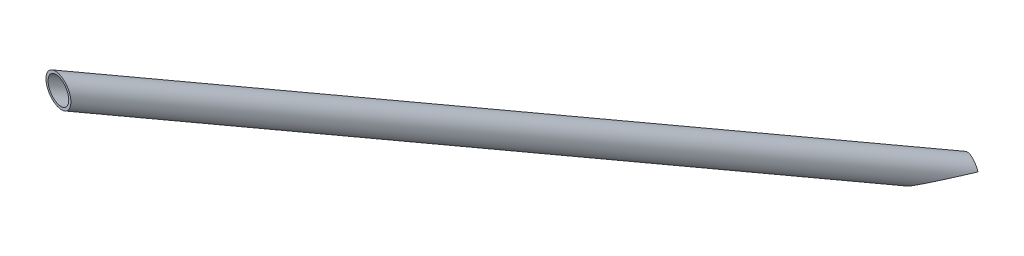
ISO-10303-21;
HEADER;
FILE_DESCRIPTION(('STEP AP214'),'2;1');
FILE_NAME('part.step','',(''),(''),'','','');
FILE_SCHEMA(('AUTOMOTIVE_DESIGN { 1 0 10303 214 1 1 1 1 }'));
ENDSEC;
DATA;
#1=APPLICATION_CONTEXT('core data for automotive mechanical design processes');
#2=APPLICATION_PROTOCOL_DEFINITION('international standard','automotive_design',2000,#1);
#3=PRODUCT_CONTEXT('',#1,'mechanical');
#4=PRODUCT('Part','Part','',(#3));
#5=PRODUCT_RELATED_PRODUCT_CATEGORY('part','',(#4));
#6=PRODUCT_DEFINITION_FORMATION('','',#4);
#7=PRODUCT_DEFINITION_CONTEXT('part definition',#1,'design');
#8=PRODUCT_DEFINITION('design','',#6,#7);
#9=PRODUCT_DEFINITION_SHAPE('','',#8);
#10=(LENGTH_UNIT() NAMED_UNIT(*) SI_UNIT(.MILLI.,.METRE.));
#11=(NAMED_UNIT(*) PLANE_ANGLE_UNIT() SI_UNIT($,.RADIAN.));
#12=(NAMED_UNIT(*) SI_UNIT($,.STERADIAN.) SOLID_ANGLE_UNIT());
#13=UNCERTAINTY_MEASURE_WITH_UNIT(LENGTH_MEASURE(1.E-05),#10,'distance_accuracy_value','');
#14=(GEOMETRIC_REPRESENTATION_CONTEXT(3) GLOBAL_UNCERTAINTY_ASSIGNED_CONTEXT((#13)) GLOBAL_UNIT_ASSIGNED_CONTEXT((#10,
#11,#12)) REPRESENTATION_CONTEXT('',''));
#15=CARTESIAN_POINT('',(0.,0.,0.));
#16=DIRECTION('',(0.,0.,1.));
#17=DIRECTION('',(1.,0.,0.));
#18=AXIS2_PLACEMENT_3D('',#15,#16,#17);
#19=CARTESIAN_POINT('',(325.,320.,-1580.));
#20=DIRECTION('',(-0.345452680982297,0.355322757581791,0.86856674075549));
#21=DIRECTION('',(0.,-0.925546956205677,0.378632845720504));
#22=AXIS2_PLACEMENT_3D('',#19,#20,#21);
#23=CYLINDRICAL_SURFACE('',#22,7.90000000000002);
#24=CARTESIAN_POINT('',(150.,500.,-1140.));
#25=DIRECTION('',(-0.136924020573454,-0.023039322625737,0.990313587810925));
#26=DIRECTION('',(-0.508281006832033,0.859722512143853,-0.050275443378224));
#27=AXIS2_PLACEMENT_3D('',#24,#25,#26);
#28=ELLIPSE('',#27,8.78492461028727,7.90000000000002);
#29=CARTESIAN_POINT('',(145.53478967414,507.552597454951,-1140.44166597983));
#30=VERTEX_POINT('',#29);
#31=EDGE_CURVE('E163',#30,#30,#28,.T.);
#32=ORIENTED_EDGE('',*,*,#31,.T.);
#33=EDGE_LOOP('',(#32));
#34=FACE_BOUND('',#33,.T.);
#35=CARTESIAN_POINT('',(315.062751652289,322.909348775049,-1552.02371895885));
#36=CARTESIAN_POINT('',(314.990461108604,322.816361961436,-1552.25101062063));
#37=CARTESIAN_POINT('',(314.92515560105,322.726669994023,-1552.48188009347));
#38=CARTESIAN_POINT('',(314.805815172278,322.552901900339,-1552.94863312008));
#39=CARTESIAN_POINT('',(314.751785390357,322.468828346669,-1553.18451890648));
#40=CARTESIAN_POINT('',(314.652995379048,322.3054588544,-1553.66027760327));
#41=CARTESIAN_POINT('',(314.608250242076,322.226170840864,-1553.90015633119));
#42=CARTESIAN_POINT('',(314.526657663239,322.071941165555,-1554.38264373257));
#43=CARTESIAN_POINT('',(314.489811008037,321.996999937248,-1554.62525267543));
#44=CARTESIAN_POINT('',(314.422524563601,321.850242328214,-1555.11518675405));
#45=CARTESIAN_POINT('',(314.392158130219,321.778468347375,-1555.36253453662));
#46=CARTESIAN_POINT('',(314.337418874542,321.638562161107,-1555.8589163578));
#47=CARTESIAN_POINT('',(314.313046233186,321.570430065668,-1556.10795044708));
#48=CARTESIAN_POINT('',(314.269588176727,321.437623084972,-1556.60704804351));
#49=CARTESIAN_POINT('',(314.250496027823,321.372943882293,-1556.85710982304));
#50=CARTESIAN_POINT('',(314.216961638409,321.246743004162,-1557.35833484657));
#51=CARTESIAN_POINT('',(314.202519408095,321.185221335634,-1557.60949809298));
#52=CARTESIAN_POINT('',(314.175492941312,321.054038869037,-1558.15944655163));
#53=CARTESIAN_POINT('',(314.163751071088,320.984986760279,-1558.45841832644));
#54=CARTESIAN_POINT('',(314.145424383004,320.85092730098,-1559.05742879499));
#55=CARTESIAN_POINT('',(314.138839783484,320.785920121794,-1559.35746753336));
#56=CARTESIAN_POINT('',(314.125947872865,320.596772968841,-1560.25903105902));
#57=CARTESIAN_POINT('',(314.126506776322,320.478530190052,-1560.86190706458));
#58=CARTESIAN_POINT('',(314.142348968923,320.257426808514,-1562.07228632831));
#59=CARTESIAN_POINT('',(314.157680826454,320.154618237044,-1562.6797982904));
#60=CARTESIAN_POINT('',(314.200339824828,319.966016013259,-1563.89692510267));
#61=CARTESIAN_POINT('',(314.227664310919,319.880218601362,-1564.50653945785));
#62=CARTESIAN_POINT('',(314.275676031674,319.766699507251,-1565.41885295263));
#63=CARTESIAN_POINT('',(314.292730299486,319.731552391651,-1565.72083635104));
#64=CARTESIAN_POINT('',(314.328923157309,319.666576342507,-1566.32524727858));
#65=CARTESIAN_POINT('',(314.34806168656,319.636747253998,-1566.62767479451));
#66=CARTESIAN_POINT('',(314.388175806031,319.583037738301,-1567.23315747072));
#67=CARTESIAN_POINT('',(314.409152695485,319.559161564818,-1567.53621292467));
#68=CARTESIAN_POINT('',(314.452674094908,319.518254844994,-1568.1426727368));
#69=CARTESIAN_POINT('',(314.475218564923,319.501224124251,-1568.4460770859));
#70=CARTESIAN_POINT('',(314.521510253435,319.475214412831,-1569.05167636893));
#71=CARTESIAN_POINT('',(314.54525115473,319.466197029622,-1569.35387008803));
#72=CARTESIAN_POINT('',(314.593797682306,319.457566442898,-1569.95836317003));
#73=CARTESIAN_POINT('',(314.618603438231,319.457954387714,-1570.26066254133));
#74=CARTESIAN_POINT('',(314.669030059676,319.470112385238,-1570.86459016211));
#75=CARTESIAN_POINT('',(314.694649829055,319.481867710745,-1571.16621877386));
#76=CARTESIAN_POINT('',(314.746575526587,319.51935304317,-1571.76851453476));
#77=CARTESIAN_POINT('',(314.772881201964,319.5450779693,-1572.06918199351));
#78=CARTESIAN_POINT('',(314.808986249113,319.591746094343,-1572.47513766504));
#79=CARTESIAN_POINT('',(314.818486933009,319.605068956167,-1572.58134446205));
#80=CARTESIAN_POINT('',(314.837585541107,319.634104771446,-1572.79342550757));
#81=CARTESIAN_POINT('',(314.847183468619,319.649817806502,-1572.8992997446));
#82=CARTESIAN_POINT('',(314.876144233442,319.700842657583,-1573.21634486175));
#83=CARTESIAN_POINT('',(314.895670566149,319.740035846128,-1573.42689878998));
#84=CARTESIAN_POINT('',(314.935327467006,319.830483029454,-1573.84510012644));
#85=CARTESIAN_POINT('',(314.955457264705,319.881722173042,-1574.0527507827));
#86=CARTESIAN_POINT('',(314.996717658919,319.998238387234,-1574.46400723767));
#87=CARTESIAN_POINT('',(315.017848088566,320.063513123617,-1574.6676137028));
#88=CARTESIAN_POINT('',(315.058385593348,320.198821273615,-1575.0381520616));
#89=CARTESIAN_POINT('',(315.07756168892,320.266598538154,-1575.2059288838));
#90=CARTESIAN_POINT('',(315.117657241593,320.414602533725,-1575.5357090626));
#91=CARTESIAN_POINT('',(315.138576516191,320.494827962244,-1575.69771302107));
#92=CARTESIAN_POINT('',(315.182887658046,320.668255396865,-1576.01408568369));
#93=CARTESIAN_POINT('',(315.206276944846,320.761443891942,-1576.16846211364));
#94=CARTESIAN_POINT('',(315.256464143419,320.960876025869,-1576.46797728916));
#95=CARTESIAN_POINT('',(315.28326194341,321.067119236583,-1576.61311633744));
#96=CARTESIAN_POINT('',(315.341482296061,321.29268164266,-1576.89344497855));
#97=CARTESIAN_POINT('',(315.372933385562,321.412080271272,-1577.02856485052));
#98=CARTESIAN_POINT('',(315.441401701212,321.661967626692,-1577.28659389517));
#99=CARTESIAN_POINT('',(315.478419162139,321.792456821173,-1577.40950255243));
#100=CARTESIAN_POINT('',(315.559046658619,322.06269801333,-1577.64254886529));
#101=CARTESIAN_POINT('',(315.602663016094,322.202458820577,-1577.75267409326));
#102=CARTESIAN_POINT('',(315.697301499069,322.488924279579,-1577.95991479413));
#103=CARTESIAN_POINT('',(315.748323674102,322.635628977772,-1578.05703018001));
#104=CARTESIAN_POINT('',(315.853666933349,322.920894808846,-1578.23075534275));
#105=CARTESIAN_POINT('',(315.907324461549,323.059067733333,-1578.30841111571));
#106=CARTESIAN_POINT('',(316.021707566458,323.337756280563,-1578.45360142389));
#107=CARTESIAN_POINT('',(316.082432525215,323.478271697566,-1578.52113684281));
#108=CARTESIAN_POINT('',(316.211186757689,323.76021927577,-1578.64665297912));
#109=CARTESIAN_POINT('',(316.279216462067,323.901651490559,-1578.70463313266));
#110=CARTESIAN_POINT('',(316.422701328045,324.184150277355,-1578.81162279187));
#111=CARTESIAN_POINT('',(316.498157367829,324.325216804088,-1578.86063123465));
#112=CARTESIAN_POINT('',(316.669464909167,324.628772301231,-1578.9575614315));
#113=CARTESIAN_POINT('',(316.766634259358,324.790994551339,-1579.00399660855));
#114=CARTESIAN_POINT('',(316.970952532566,325.111796711775,-1579.08629188208));
#115=CARTESIAN_POINT('',(317.078102246024,325.270376332365,-1579.12215114003));
#116=CARTESIAN_POINT('',(317.302184512607,325.582562626691,-1579.18401427555));
#117=CARTESIAN_POINT('',(317.419121010747,325.736167260088,-1579.21001415527));
#118=CARTESIAN_POINT('',(317.662382036086,326.037107768725,-1579.25274390734));
#119=CARTESIAN_POINT('',(317.78870708455,326.184443295178,-1579.26947326454));
#120=CARTESIAN_POINT('',(318.06452880178,326.487394422179,-1579.29551426891));
#121=CARTESIAN_POINT('',(318.215050892737,326.642165252156,-1579.30382010794));
#122=CARTESIAN_POINT('',(318.526297835128,326.941322338469,-1579.31022499931));
#123=CARTESIAN_POINT('',(318.687023416212,327.085707850571,-1579.3083233209));
#124=CARTESIAN_POINT('',(319.017791096688,327.362951790847,-1579.29476287675));
#125=CARTESIAN_POINT('',(319.187834945043,327.4958080429,-1579.28310227344));
#126=CARTESIAN_POINT('',(319.536169125463,327.74895060777,-1579.25037224056));
#127=CARTESIAN_POINT('',(319.714459405022,327.869237000606,-1579.22930287088));
#128=CARTESIAN_POINT('',(320.082831857141,328.09931774369,-1579.17734933842));
#129=CARTESIAN_POINT('',(320.273099597998,328.20876123772,-1579.14622592942));
#130=CARTESIAN_POINT('',(320.659739750878,328.412763930956,-1579.0745253222));
#131=CARTESIAN_POINT('',(320.856112307659,328.507322776893,-1579.03394789965));
#132=CARTESIAN_POINT('',(321.253479924036,328.68097143044,-1578.94341403271));
#133=CARTESIAN_POINT('',(321.454474953914,328.760061337467,-1578.89345764859));
#134=CARTESIAN_POINT('',(321.859498670515,328.902372941722,-1578.78412841875));
#135=CARTESIAN_POINT('',(322.063527343005,328.965594713372,-1578.72475561719));
#136=CARTESIAN_POINT('',(322.47311997743,329.076020068955,-1578.59636630811));
#137=CARTESIAN_POINT('',(322.678685257785,329.123207755006,-1578.52734032455));
#138=CARTESIAN_POINT('',(323.089322026647,329.201484079505,-1578.37937967562));
#139=CARTESIAN_POINT('',(323.294393508826,329.232572512763,-1578.30044488399));
#140=CARTESIAN_POINT('',(323.702196765438,329.278905321445,-1578.13213951703));
#141=CARTESIAN_POINT('',(323.904926906553,329.294139227578,-1578.04276208935));
#142=CARTESIAN_POINT('',(324.305747069698,329.309240164275,-1577.85296255141));
#143=CARTESIAN_POINT('',(324.50383717814,329.309107481243,-1577.75254064703));
#144=CARTESIAN_POINT('',(324.889400514817,329.294456245535,-1577.54179193939));
#145=CARTESIAN_POINT('',(325.077002258722,329.280203438727,-1577.43168233156));
#146=CARTESIAN_POINT('',(325.442953692708,329.238882986111,-1577.1991172168));
#147=CARTESIAN_POINT('',(325.621303180098,329.21181505969,-1577.07666143958));
#148=CARTESIAN_POINT('',(325.965666165719,329.146566756984,-1576.81873935243));
#149=CARTESIAN_POINT('',(326.131702671234,329.108407796799,-1576.68329845061));
#150=CARTESIAN_POINT('',(326.448883173169,329.023127368074,-1576.39850268581));
#151=CARTESIAN_POINT('',(326.600030532872,328.97600793068,-1576.24915098001));
#152=CARTESIAN_POINT('',(326.867776827562,328.881461767059,-1575.9548203158));
#153=CARTESIAN_POINT('',(326.98634766643,328.834729716892,-1575.81141122865));
#154=CARTESIAN_POINT('',(327.208058499631,328.738522514176,-1575.51398969263));
#155=CARTESIAN_POINT('',(327.311201095753,328.689047826075,-1575.359979038));
#156=CARTESIAN_POINT('',(327.500890221682,328.589554361235,-1575.04244659843));
#157=CARTESIAN_POINT('',(327.587453047947,328.53953617036,-1574.87893436096));
#158=CARTESIAN_POINT('',(327.743827171241,328.440843657172,-1574.54370696042));
#159=CARTESIAN_POINT('',(327.813636642432,328.392169481845,-1574.37199090572));
#160=CARTESIAN_POINT('',(327.942306450037,328.293639541855,-1574.00714404038));
#161=CARTESIAN_POINT('',(327.999721480918,328.244038206614,-1573.81343714939));
#162=CARTESIAN_POINT('',(328.097011094854,328.149404460791,-1573.42061522314));
#163=CARTESIAN_POINT('',(328.136882442589,328.10437289412,-1573.22149919755));
#164=CARTESIAN_POINT('',(328.201249658107,328.019269249918,-1572.81924128979));
#165=CARTESIAN_POINT('',(328.22570395451,327.979210813518,-1572.61609003353));
#166=CARTESIAN_POINT('',(328.261273547947,327.904180594878,-1572.20775530749));
#167=CARTESIAN_POINT('',(328.272389283933,327.869208645284,-1572.0025719048));
#168=CARTESIAN_POINT('',(328.284591159618,327.796614221893,-1571.54444536427));
#169=CARTESIAN_POINT('',(328.282825002288,327.760194602494,-1571.29124208635));
#170=CARTESIAN_POINT('',(328.265544193672,327.693607973211,-1570.78443601976));
#171=CARTESIAN_POINT('',(328.250023094424,327.663443903953,-1570.53083309942));
#172=CARTESIAN_POINT('',(328.207741519943,327.608358435742,-1570.0235700749));
#173=CARTESIAN_POINT('',(328.180961058985,327.583446478098,-1569.76991067463));
#174=CARTESIAN_POINT('',(328.118142310486,327.538015050635,-1569.26341178618));
#175=CARTESIAN_POINT('',(328.082105413575,327.517494921862,-1569.0105721806));
#176=CARTESIAN_POINT('',(328.001970038106,327.47988278605,-1568.50392881523));
#177=CARTESIAN_POINT('',(327.957811664093,327.462818371192,-1568.25013260589));
#178=CARTESIAN_POINT('',(327.862788011731,327.431600014905,-1567.74362434439));
#179=CARTESIAN_POINT('',(327.811922572922,327.417446143128,-1567.49091231832));
#180=CARTESIAN_POINT('',(327.704433955343,327.391455406751,-1566.98691054035));
#181=CARTESIAN_POINT('',(327.647817520325,327.379615874895,-1566.73561947918));
#182=CARTESIAN_POINT('',(327.529445775555,327.357718073516,-1566.23416590704));
#183=CARTESIAN_POINT('',(327.467690227295,327.347659886733,-1565.98400344902));
#184=CARTESIAN_POINT('',(327.332857148641,327.327903052083,-1565.45872573462));
#185=CARTESIAN_POINT('',(327.25927091203,327.318351899099,-1565.18373569297));
#186=CARTESIAN_POINT('',(327.106964571378,327.30038056151,-1564.63514079829));
#187=CARTESIAN_POINT('',(327.028244297078,327.291960414439,-1564.36153599152));
#188=CARTESIAN_POINT('',(326.784948771994,327.267726736659,-1563.54273530184));
#189=CARTESIAN_POINT('',(326.613254194326,327.252941998318,-1562.99961234614));
#190=CARTESIAN_POINT('',(326.252328600574,327.223180560216,-1561.91813770431));
#191=CARTESIAN_POINT('',(326.06306563927,327.208203555192,-1561.37979674018));
#192=CARTESIAN_POINT('',(325.667796502895,327.175644985669,-1560.30943364465));
#193=CARTESIAN_POINT('',(325.461792262924,327.158063721999,-1559.77741079109));
#194=CARTESIAN_POINT('',(325.033734901601,327.118080684182,-1558.72333685489));
#195=CARTESIAN_POINT('',(324.811773092891,327.095705080792,-1558.20124775583));
#196=CARTESIAN_POINT('',(324.34943018719,327.043642373536,-1557.16541936904));
#197=CARTESIAN_POINT('',(324.109044319539,327.013953371528,-1556.65168228599));
#198=CARTESIAN_POINT('',(323.73314931627,326.961748711776,-1555.8899505183));
#199=CARTESIAN_POINT('',(323.605461514756,326.943095739767,-1555.63781774425));
#200=CARTESIAN_POINT('',(323.344438953733,326.90276300349,-1555.13674388472));
#201=CARTESIAN_POINT('',(323.211104531013,326.881083419565,-1554.88780261003));
#202=CARTESIAN_POINT('',(322.938288317295,326.834163234884,-1554.39380310773));
#203=CARTESIAN_POINT('',(322.798809542102,326.808924368014,-1554.14874305367));
#204=CARTESIAN_POINT('',(322.512934927317,326.754207109758,-1553.6631917136));
#205=CARTESIAN_POINT('',(322.366540076031,326.724729322891,-1553.42269978165));
#206=CARTESIAN_POINT('',(322.138091115653,326.676055571239,-1553.06152478981));
#207=CARTESIAN_POINT('',(322.058903995876,326.658721019566,-1552.93877367369));
#208=CARTESIAN_POINT('',(321.898241538903,326.622521918364,-1552.69501030487));
#209=CARTESIAN_POINT('',(321.816766217029,326.603657379078,-1552.57399804053));
#210=CARTESIAN_POINT('',(321.568543354148,326.544500100998,-1552.21377184192));
#211=CARTESIAN_POINT('',(321.398077769881,326.501660251374,-1551.97749418971));
#212=CARTESIAN_POINT('',(321.046363102117,326.407715254764,-1551.51669069141));
#213=CARTESIAN_POINT('',(320.865173185669,326.356653192526,-1551.29211125277));
#214=CARTESIAN_POINT('',(320.489012572297,326.24375548736,-1550.85782783561));
#215=CARTESIAN_POINT('',(320.29405822884,326.181932505556,-1550.6481067785));
#216=CARTESIAN_POINT('',(319.950746640838,326.0655241845,-1550.3127330563));
#217=CARTESIAN_POINT('',(319.806832421189,326.014700335426,-1550.18126843681));
#218=CARTESIAN_POINT('',(319.509629532681,325.904617898005,-1549.93245438139));
#219=CARTESIAN_POINT('',(319.35632560275,325.845345358784,-1549.81512889608));
#220=CARTESIAN_POINT('',(319.038089129016,325.715886537052,-1549.59958755831));
#221=CARTESIAN_POINT('',(318.873047863291,325.645588123127,-1549.50159442185));
#222=CARTESIAN_POINT('',(318.533675399338,325.492757895576,-1549.33580564097));
#223=CARTESIAN_POINT('',(318.359375613204,325.410265941683,-1549.26791438437));
#224=CARTESIAN_POINT('',(318.062448387749,325.261160610052,-1549.18897639957));
#225=CARTESIAN_POINT('',(317.941156949152,325.197927349852,-1549.16668639049));
#226=CARTESIAN_POINT('',(317.699207257238,325.066515090439,-1549.14473630259));
#227=CARTESIAN_POINT('',(317.57854844333,324.998341760205,-1549.14505068238));
#228=CARTESIAN_POINT('',(317.341222643887,324.85858864738,-1549.16979722077));
#229=CARTESIAN_POINT('',(317.224569025284,324.786999065407,-1549.19430328966));
#230=CARTESIAN_POINT('',(316.999146496046,324.642904836231,-1549.26619111236));
#231=CARTESIAN_POINT('',(316.890383815472,324.570399517935,-1549.31359071984));
#232=CARTESIAN_POINT('',(316.656715185982,324.408369686723,-1549.44216113811));
#233=CARTESIAN_POINT('',(316.534650729362,324.319162093108,-1549.52883292485));
#234=CARTESIAN_POINT('',(316.306659623792,324.144661003018,-1549.72453635249));
#235=CARTESIAN_POINT('',(316.20077462896,324.059377991718,-1549.83362406681));
#236=CARTESIAN_POINT('',(316.019443900696,323.906783326722,-1550.04869834345));
#237=CARTESIAN_POINT('',(315.941835392217,323.838770801099,-1550.15241829884));
#238=CARTESIAN_POINT('',(315.795674956473,323.706000700237,-1550.36808342155));
#239=CARTESIAN_POINT('',(315.727130337456,323.641245777364,-1550.48003511436));
#240=CARTESIAN_POINT('',(315.597845220741,323.514766202348,-1550.71016548713));
#241=CARTESIAN_POINT('',(315.537115016733,323.453045612015,-1550.82835209714));
#242=CARTESIAN_POINT('',(315.422485362699,323.332480670533,-1551.06931518989));
#243=CARTESIAN_POINT('',(315.368583461234,323.273635291839,-1551.19209000479));
#244=CARTESIAN_POINT('',(315.270451527524,323.162809816853,-1551.43196773065));
#245=CARTESIAN_POINT('',(315.225800488723,323.110644430762,-1551.54881465274));
#246=CARTESIAN_POINT('',(315.14104146727,323.008465994327,-1551.78468546974));
#247=CARTESIAN_POINT('',(315.100922812195,322.958448067303,-1551.90370345025));
#248=CARTESIAN_POINT('',(315.062751652289,322.909348775049,-1552.02371895885));
#249=B_SPLINE_CURVE_WITH_KNOTS('',3,(#35,#36,#37,#38,#39,#40,#41,#42,#43,#44,#45,#46,#47,#48,
#49,#50,#51,#52,#53,#54,#55,#56,#57,#58,#59,#60,#61,#62,#63,#64,#65,#66,#67,#68,#69,#70,#71,#72,
#73,#74,#75,#76,#77,#78,#79,#80,#81,#82,#83,#84,#85,#86,#87,#88,#89,#90,#91,#92,#93,#94,#95,#96,
#97,#98,#99,#100,#101,#102,#103,#104,#105,#106,#107,#108,#109,#110,#111,#112,#113,#114,#115,
#116,#117,#118,#119,#120,#121,#122,#123,#124,#125,#126,#127,#128,#129,#130,#131,#132,#133,#134,
#135,#136,#137,#138,#139,#140,#141,#142,#143,#144,#145,#146,#147,#148,#149,#150,#151,#152,#153,
#154,#155,#156,#157,#158,#159,#160,#161,#162,#163,#164,#165,#166,#167,#168,#169,#170,#171,#172,
#173,#174,#175,#176,#177,#178,#179,#180,#181,#182,#183,#184,#185,#186,#187,#188,#189,#190,#191,
#192,#193,#194,#195,#196,#197,#198,#199,#200,#201,#202,#203,#204,#205,#206,#207,#208,#209,#210,
#211,#212,#213,#214,#215,#216,#217,#218,#219,#220,#221,#222,#223,#224,#225,#226,#227,#228,#229,
#230,#231,#232,#233,#234,#235,#236,#237,#238,#239,#240,#241,#242,#243,#244,#245,#246,#247,#248),
.UNSPECIFIED.,.T.,.F.,(4,2,2,2,2,2,2,2,2,2,2,2,2,2,2,2,2,2,2,2,2,2,2,2,2,2,2,2,2,2,2,2,2,2,2,2,
2,2,2,2,2,2,2,2,2,2,2,2,2,2,2,2,2,2,2,2,2,2,2,2,2,2,2,2,2,2,2,2,2,2,2,2,2,2,2,2,2,2,2,2,2,2,2,2,
2,2,2,2,2,2,2,2,2,2,2,2,2,2,2,2,2,2,2,2,2,2,4),(0.,0.767927754732313,1.5362047580638,
2.3057209967097,3.07531384095388,3.8532037452833,4.63111712947335,5.40803387873612,
6.18495233160369,7.10606963456843,8.02722593212893,9.86983487678151,11.71852242836,
13.5668009510208,14.4802583981469,15.39368922331,16.3077708892754,17.2218292656712,
18.1314843308896,19.0412504597933,19.9498395028609,20.858098310373,21.1804554061736,
21.5028235097199,22.147678860814,22.7917433149875,23.4357007392037,23.9811312414455,
24.5265047109914,25.0713139543726,25.6161053352189,26.1643879692909,26.7126937351133,
27.2615281584772,27.8103662528346,28.3118911986247,28.8133723256088,29.3148830343174,
29.816453119338,30.3999946598012,30.9835824558944,31.5674066374782,32.1512632580809,
32.798681941065,33.4461469732459,34.093733948406,34.7413168008353,35.4056109393125,
36.0699208416002,36.7342264743282,37.3985289914041,38.0634882590821,38.7284560016542,
39.393862567239,40.0592567308947,40.7123613605518,41.3654802918632,42.0173463753167,
42.6690648705271,43.2437481015081,43.8183343095294,44.3923528184436,44.9664338574784,
45.5895694683023,46.2128199465829,46.8377438833506,47.4626472542241,48.229519564417,
48.9967515547791,49.7653511946279,50.5338354322255,51.3082326890427,52.0826484759532,
52.8561664246172,53.6297202924119,54.4841372939936,55.3385826448417,57.0476568227976,
58.7599019333718,60.471949408877,62.1748792021624,63.8782514453862,64.72789006453,
65.5774780787484,66.4266536410761,67.2757082211281,67.7169808172812,68.1582504593673,
69.0412372153341,69.9197392615194,70.797214578308,71.4008745296848,72.0055430753869,
72.6168159453228,73.2261330795592,73.6402364367586,74.0538718935967,74.4687750104412,
74.8840022155725,75.4038959891532,75.9251064635645,76.363414059352,76.8020729368752,
77.2413038564687,77.6803766375191,78.0868390896068,78.4923235641747),.UNSPECIFIED.);
#250=CARTESIAN_POINT('',(324.682386689561,329.302305976698,-1577.65492780783));
#251=VERTEX_POINT('',#250);
#252=CARTESIAN_POINT('',(314.254237401406,319.817607713584,-1565.01054982519));
#253=VERTEX_POINT('',#252);
#254=EDGE_CURVE('E149',#251,#253,#249,.T.);
#255=ORIENTED_EDGE('',*,*,#254,.T.);
#256=CARTESIAN_POINT('',(317.472241548848,320.431016310017,-1558.08186498448));
#257=CARTESIAN_POINT('',(317.372200351348,320.41096420389,-1558.13088151159));
#258=CARTESIAN_POINT('',(317.274634618302,320.391364441935,-1558.18512204288));
#259=CARTESIAN_POINT('',(317.085112776127,320.353214028701,-1558.30300958479));
#260=CARTESIAN_POINT('',(316.993159849986,320.334663973131,-1558.36666186401));
#261=CARTESIAN_POINT('',(316.725974351384,320.280663206938,-1558.57026669526));
#262=CARTESIAN_POINT('',(316.559808275911,320.246940831667,-1558.72266767291));
#263=CARTESIAN_POINT('',(316.194967254027,320.172736844811,-1559.11159361704));
#264=CARTESIAN_POINT('',(316.007002065735,320.134368878228,-1559.35838396216));
#265=CARTESIAN_POINT('',(315.7545467975,320.082913559005,-1559.74779091336));
#266=CARTESIAN_POINT('',(315.675227554497,320.066761066815,-1559.88098042631));
#267=CARTESIAN_POINT('',(315.525419818209,320.036328173552,-1560.15245995304));
#268=CARTESIAN_POINT('',(315.454930266803,320.022047548151,-1560.29074935309));
#269=CARTESIAN_POINT('',(315.264205982685,319.983585227727,-1560.69276730713));
#270=CARTESIAN_POINT('',(315.153794586992,319.961546961928,-1560.96135432343));
#271=CARTESIAN_POINT('',(314.955431018259,319.922680737625,-1561.50710519849));
#272=CARTESIAN_POINT('',(314.867499561107,319.905857581977,-1561.78427670633));
#273=CARTESIAN_POINT('',(314.710058734077,319.876819480604,-1562.34481512674));
#274=CARTESIAN_POINT('',(314.640602051664,319.864617673241,-1562.62819731546));
#275=CARTESIAN_POINT('',(314.517458296284,319.844498232192,-1563.19835672772));
#276=CARTESIAN_POINT('',(314.463766027936,319.836579186337,-1563.48513280027));
#277=CARTESIAN_POINT('',(314.364454804591,319.824105251797,-1564.09378023534));
#278=CARTESIAN_POINT('',(314.320455778816,319.820037247596,-1564.4159228534));
#279=CARTESIAN_POINT('',(314.246693887713,319.816772211958,-1565.06189712009));
#280=CARTESIAN_POINT('',(314.216934390634,319.81757633237,-1565.38572915003));
#281=CARTESIAN_POINT('',(314.169787496809,319.82410277065,-1566.03459892683));
#282=CARTESIAN_POINT('',(314.152414376802,319.829830747122,-1566.35963763234));
#283=CARTESIAN_POINT('',(314.12865356126,319.846426395056,-1567.00994409719));
#284=CARTESIAN_POINT('',(314.12226492524,319.857293626397,-1567.33521183453));
#285=CARTESIAN_POINT('',(314.119339929332,319.884569301565,-1567.98555110755));
#286=CARTESIAN_POINT('',(314.122803538184,319.900977727812,-1568.31062264384));
#287=CARTESIAN_POINT('',(314.138695720197,319.939957146111,-1568.96019242376));
#288=CARTESIAN_POINT('',(314.151124785078,319.962528476132,-1569.28469063498));
#289=CARTESIAN_POINT('',(314.18424543747,320.014705460545,-1569.93241210058));
#290=CARTESIAN_POINT('',(314.204929739348,320.044304902993,-1570.25563622605));
#291=CARTESIAN_POINT('',(314.254047687878,320.11179481533,-1570.90060009112));
#292=CARTESIAN_POINT('',(314.282480397052,320.149684282101,-1571.2223400055));
#293=CARTESIAN_POINT('',(314.343137225433,320.230662078367,-1571.8275590016));
#294=CARTESIAN_POINT('',(314.374571630404,320.272681513037,-1572.11125923003));
#295=CARTESIAN_POINT('',(314.443184373122,320.366293121351,-1572.67643371717));
#296=CARTESIAN_POINT('',(314.480363300743,320.417886278178,-1572.95790774415));
#297=CARTESIAN_POINT('',(314.560492474724,320.532819928765,-1573.51744182456));
#298=CARTESIAN_POINT('',(314.603438669156,320.596152186717,-1573.79550412663));
#299=CARTESIAN_POINT('',(314.695389908516,320.737515128979,-1574.34686512993));
#300=CARTESIAN_POINT('',(314.744393233642,320.815541644427,-1574.62016515829));
#301=CARTESIAN_POINT('',(314.83359406808,320.964308299456,-1575.07980982843));
#302=CARTESIAN_POINT('',(314.872113848367,321.030386601952,-1575.26798195988));
#303=CARTESIAN_POINT('',(314.952816971557,321.173335644566,-1575.63944806335));
#304=CARTESIAN_POINT('',(314.995000575078,321.250207152676,-1575.82274168713));
#305=CARTESIAN_POINT('',(315.083408732528,321.416231733874,-1576.18222634444));
#306=CARTESIAN_POINT('',(315.129624326285,321.505357815871,-1576.35843191654));
#307=CARTESIAN_POINT('',(315.226792440457,321.697556851875,-1576.70171271866));
#308=CARTESIAN_POINT('',(315.27774298984,321.80062401066,-1576.86879170225));
#309=CARTESIAN_POINT('',(315.371880357011,321.994390545434,-1577.15110231233));
#310=CARTESIAN_POINT('',(315.413877369746,322.081858943755,-1577.26894866897));
#311=CARTESIAN_POINT('',(315.501348539571,322.265301471033,-1577.49642823002));
#312=CARTESIAN_POINT('',(315.546821686075,322.36127312919,-1577.60606380327));
#313=CARTESIAN_POINT('',(315.641569328216,322.561261910557,-1577.81575898129));
#314=CARTESIAN_POINT('',(315.690840241826,322.665271452726,-1577.91582741483));
#315=CARTESIAN_POINT('',(315.793559479206,322.880559441928,-1578.10546390026));
#316=CARTESIAN_POINT('',(315.847007883701,322.99183802942,-1578.19503174913));
#317=CARTESIAN_POINT('',(315.958377174429,323.22040724004,-1578.36302206274));
#318=CARTESIAN_POINT('',(316.016298226233,323.33769808568,-1578.44144411457));
#319=CARTESIAN_POINT('',(316.136852872291,323.576782935774,-1578.58695861579));
#320=CARTESIAN_POINT('',(316.199486535187,323.698577005808,-1578.65405090012));
#321=CARTESIAN_POINT('',(316.329767091309,323.945304030652,-1578.77725327219));
#322=CARTESIAN_POINT('',(316.397422377865,324.070241999003,-1578.83334437519));
#323=CARTESIAN_POINT('',(316.537802214069,324.321567102478,-1578.93496993577));
#324=CARTESIAN_POINT('',(316.610527956798,324.447954572787,-1578.98050189781));
#325=CARTESIAN_POINT('',(316.783053999879,324.737583298024,-1579.07355628947));
#326=CARTESIAN_POINT('',(316.884577590271,324.900853806714,-1579.11780720929));
#327=CARTESIAN_POINT('',(317.096346263079,325.225031981314,-1579.19169412126));
#328=CARTESIAN_POINT('',(317.206593722356,325.385938989021,-1579.22132611438));
#329=CARTESIAN_POINT('',(317.435872046149,325.703443444159,-1579.26769434292));
#330=CARTESIAN_POINT('',(317.554909030111,325.860037782869,-1579.28442149916));
#331=CARTESIAN_POINT('',(317.801576127488,326.16710459829,-1579.3064836556));
#332=CARTESIAN_POINT('',(317.929205668063,326.317577482029,-1579.31181941444));
#333=CARTESIAN_POINT('',(318.194879103413,326.613259233816,-1579.31243974532));
#334=CARTESIAN_POINT('',(318.333053009944,326.7583515035,-1579.30756842222));
#335=CARTESIAN_POINT('',(318.617706337228,327.039502908682,-1579.2886471726));
#336=CARTESIAN_POINT('',(318.764185792504,327.175562006628,-1579.27459720793));
#337=CARTESIAN_POINT('',(319.064966662236,327.437497127557,-1579.2383328951));
#338=CARTESIAN_POINT('',(319.219266260371,327.563375497665,-1579.21612043537));
#339=CARTESIAN_POINT('',(319.535158787272,327.80399074415,-1579.1643942782));
#340=CARTESIAN_POINT('',(319.696751954287,327.918727256186,-1579.13488034212));
#341=CARTESIAN_POINT('',(320.044437943887,328.147952693975,-1579.06574441603));
#342=CARTESIAN_POINT('',(320.231289066626,328.261069781741,-1579.02537399427));
#343=CARTESIAN_POINT('',(320.61209378529,328.471479348692,-1578.9374631489));
#344=CARTESIAN_POINT('',(320.806047878297,328.568770717751,-1578.88992222275));
#345=CARTESIAN_POINT('',(321.199905913077,328.746656313279,-1578.78842772252));
#346=CARTESIAN_POINT('',(321.399811200042,328.827246731428,-1578.73447269024));
#347=CARTESIAN_POINT('',(321.804207772012,328.970983362347,-1578.62083281107));
#348=CARTESIAN_POINT('',(322.008698948609,329.034129987015,-1578.56114809952));
#349=CARTESIAN_POINT('',(322.419726919577,329.142152949186,-1578.43697233749));
#350=CARTESIAN_POINT('',(322.626246486692,329.187127003638,-1578.37250926038));
#351=CARTESIAN_POINT('',(323.040942873902,329.258958938808,-1578.23898303329));
#352=CARTESIAN_POINT('',(323.249119696441,329.285816792803,-1578.16991987652));
#353=CARTESIAN_POINT('',(323.665561568431,329.321268872282,-1578.02760369125));
#354=CARTESIAN_POINT('',(323.873826601148,329.329865691621,-1577.95435125932));
#355=CARTESIAN_POINT('',(324.28889650958,329.32885197357,-1577.80394577631));
#356=CARTESIAN_POINT('',(324.495701388931,329.319241481534,-1577.72679273495));
#357=CARTESIAN_POINT('',(324.905194351903,329.282148180775,-1577.56917217473));
#358=CARTESIAN_POINT('',(325.107898118243,329.254757364208,-1577.48872370197));
#359=CARTESIAN_POINT('',(325.508683148864,329.182610311967,-1577.32418465749));
#360=CARTESIAN_POINT('',(325.706764399931,329.137854026658,-1577.24009407536));
#361=CARTESIAN_POINT('',(326.096811433177,329.031541653049,-1577.06809800944));
#362=CARTESIAN_POINT('',(326.288773521694,328.969975624706,-1576.98019029443));
#363=CARTESIAN_POINT('',(326.664819886831,328.830835674583,-1576.80028985314));
#364=CARTESIAN_POINT('',(326.84890419533,328.753261817589,-1576.70829714338));
#365=CARTESIAN_POINT('',(327.210047862429,328.581873692348,-1576.51834060245));
#366=CARTESIAN_POINT('',(327.386970829743,328.487845004621,-1576.42031066302));
#367=CARTESIAN_POINT('',(327.729139349401,328.285566206863,-1576.21861292858));
#368=CARTESIAN_POINT('',(327.894383470625,328.177314358563,-1576.11494444536));
#369=CARTESIAN_POINT('',(328.21102773558,327.948263490334,-1575.90088860858));
#370=CARTESIAN_POINT('',(328.362438752918,327.82747448768,-1575.79050664788));
#371=CARTESIAN_POINT('',(328.649309939412,327.575294472791,-1575.56146944314));
#372=CARTESIAN_POINT('',(328.784776081869,327.44390746209,-1575.44281732398));
#373=CARTESIAN_POINT('',(329.00247339069,327.210525721034,-1575.22964164644));
#374=CARTESIAN_POINT('',(329.089079460253,327.110424617394,-1575.13749451637));
#375=CARTESIAN_POINT('',(329.251686135427,326.90729125651,-1574.94728546671));
#376=CARTESIAN_POINT('',(329.327689626486,326.804259805972,-1574.84922516681));
#377=CARTESIAN_POINT('',(329.468027629846,326.596913983331,-1574.64678381314));
#378=CARTESIAN_POINT('',(329.532384050256,326.492602422403,-1574.5424151295));
#379=CARTESIAN_POINT('',(329.648789199536,326.284177280705,-1574.32681011544));
#380=CARTESIAN_POINT('',(329.700838046148,326.180063698049,-1574.21557385072));
#381=CARTESIAN_POINT('',(329.79237464314,325.973152904721,-1573.98543602167));
#382=CARTESIAN_POINT('',(329.831778741896,325.870368610043,-1573.86648942407));
#383=CARTESIAN_POINT('',(329.897422651983,325.668579744142,-1573.62195275375));
#384=CARTESIAN_POINT('',(329.923663143712,325.569574977807,-1573.49636302477));
#385=CARTESIAN_POINT('',(329.963358965837,325.37678235983,-1573.2392421484));
#386=CARTESIAN_POINT('',(329.976809864746,325.282996327025,-1573.10770895817));
#387=CARTESIAN_POINT('',(329.991755679343,325.101679321434,-1572.83975516587));
#388=CARTESIAN_POINT('',(329.993248785111,325.014149297538,-1572.70333382707));
#389=CARTESIAN_POINT('',(329.984425740556,324.823976362284,-1572.39077369633));
#390=CARTESIAN_POINT('',(329.970941790919,324.723312582057,-1572.21352167478));
#391=CARTESIAN_POINT('',(329.929461887798,324.532637625335,-1571.85505848819));
#392=CARTESIAN_POINT('',(329.901460264905,324.442630627382,-1571.67384580295));
#393=CARTESIAN_POINT('',(329.833340249585,324.272182306591,-1571.30855288633));
#394=CARTESIAN_POINT('',(329.793183303905,324.191772571939,-1571.12446532495));
#395=CARTESIAN_POINT('',(329.702925744784,324.039683871818,-1570.75521154246));
#396=CARTESIAN_POINT('',(329.652826199445,323.968003969865,-1570.57004543929));
#397=CARTESIAN_POINT('',(329.526962834234,323.810268473161,-1570.13987248143));
#398=CARTESIAN_POINT('',(329.448124959278,323.726993338486,-1569.8947534069));
#399=CARTESIAN_POINT('',(329.278915086552,323.570804172418,-1569.40514170164));
#400=CARTESIAN_POINT('',(329.188537469792,323.49789522538,-1569.16064943567));
#401=CARTESIAN_POINT('',(328.998040335683,323.360165194729,-1568.67267560229));
#402=CARTESIAN_POINT('',(328.897903439663,323.295359026192,-1568.42919667368));
#403=CARTESIAN_POINT('',(328.689356958774,323.172241678593,-1567.94422508708));
#404=CARTESIAN_POINT('',(328.580948774185,323.113929404247,-1567.70273210053));
#405=CARTESIAN_POINT('',(328.355926039845,323.002009229982,-1567.22037291011));
#406=CARTESIAN_POINT('',(328.239259690524,322.94843684351,-1566.97952272812));
#407=CARTESIAN_POINT('',(327.998949633017,322.845329981481,-1566.50045173545));
#408=CARTESIAN_POINT('',(327.875305689663,322.795795642159,-1566.26223101372));
#409=CARTESIAN_POINT('',(327.621512484586,322.699924329043,-1565.78899712709));
#410=CARTESIAN_POINT('',(327.491370880577,322.653583737848,-1565.55398058342));
#411=CARTESIAN_POINT('',(327.224594965545,322.563311447785,-1565.08719164311));
#412=CARTESIAN_POINT('',(327.087960598622,322.519379769662,-1564.85541927441));
#413=CARTESIAN_POINT('',(326.798262279563,322.430266800597,-1564.37913766623));
#414=CARTESIAN_POINT('',(326.644720783316,322.385218552482,-1564.13489371011));
#415=CARTESIAN_POINT('',(326.330040142037,322.296574589717,-1563.65106900668));
#416=CARTESIAN_POINT('',(326.168900824529,322.252978908079,-1563.4114883654));
#417=CARTESIAN_POINT('',(325.83852764802,322.166655139004,-1562.93736718513));
#418=CARTESIAN_POINT('',(325.669284278827,322.123928159091,-1562.70283306024));
#419=CARTESIAN_POINT('',(325.322438538506,322.038919348274,-1562.23994679196));
#420=CARTESIAN_POINT('',(325.144836507254,321.996637499355,-1562.01159439781));
#421=CARTESIAN_POINT('',(324.782051319959,321.912397506369,-1561.56386310905));
#422=CARTESIAN_POINT('',(324.596936655636,321.870439363616,-1561.34442887646));
#423=CARTESIAN_POINT('',(324.217062835527,321.786095410509,-1560.9140533736));
#424=CARTESIAN_POINT('',(324.022302045472,321.743709528661,-1560.70311355352));
#425=CARTESIAN_POINT('',(323.622594313506,321.658177803372,-1560.29205335663));
#426=CARTESIAN_POINT('',(323.417668067248,321.615033610813,-1560.09191259992));
#427=CARTESIAN_POINT('',(322.996188302687,321.527481445344,-1559.70465647618));
#428=CARTESIAN_POINT('',(322.779640730994,321.48307412414,-1559.51753455791));
#429=CARTESIAN_POINT('',(322.405136190862,321.407056629329,-1559.2173691765));
#430=CARTESIAN_POINT('',(322.250689429119,321.375915227542,-1559.09983034251));
#431=CARTESIAN_POINT('',(321.935276198567,321.312666149363,-1558.87399348992));
#432=CARTESIAN_POINT('',(321.774308393547,321.280558275284,-1558.7656973795));
#433=CARTESIAN_POINT('',(321.445740237296,321.21528935469,-1558.56060505881));
#434=CARTESIAN_POINT('',(321.278151664818,321.182130197549,-1558.46378955244));
#435=CARTESIAN_POINT('',(320.935917671892,321.114602992801,-1558.28419749401));
#436=CARTESIAN_POINT('',(320.761276474999,321.080235670272,-1558.20141268944));
#437=CARTESIAN_POINT('',(320.367923148664,321.002939711923,-1558.03791863423));
#438=CARTESIAN_POINT('',(320.14756966283,320.959711113482,-1557.96118385583));
#439=CARTESIAN_POINT('',(319.698180925433,320.871533771598,-1557.84105603268));
#440=CARTESIAN_POINT('',(319.46915678234,320.826587228447,-1557.79762174685));
#441=CARTESIAN_POINT('',(319.048180613254,320.743801007571,-1557.75708237582));
#442=CARTESIAN_POINT('',(318.856921258655,320.70612741658,-1557.75308261687));
#443=CARTESIAN_POINT('',(318.571811499669,320.649815632778,-1557.77153760855));
#444=CARTESIAN_POINT('',(318.477108229514,320.63108544104,-1557.78175625397));
#445=CARTESIAN_POINT('',(318.288961694271,320.593816694665,-1557.81057922955));
#446=CARTESIAN_POINT('',(318.195518014823,320.575278077498,-1557.82918072912));
#447=CARTESIAN_POINT('',(317.994348788704,320.535299181774,-1557.87887478331));
#448=CARTESIAN_POINT('',(317.887007408953,320.513923098643,-1557.9115906045));
#449=CARTESIAN_POINT('',(317.676353793101,320.471883757897,-1557.98839230156));
#450=CARTESIAN_POINT('',(317.573041102517,320.451220419907,-1558.03247689059));
#451=CARTESIAN_POINT('',(317.472241548848,320.431016310017,-1558.08186498448));
#452=B_SPLINE_CURVE_WITH_KNOTS('',3,(#256,#257,#258,#259,#260,#261,#262,#263,#264,#265,#266,
#267,#268,#269,#270,#271,#272,#273,#274,#275,#276,#277,#278,#279,#280,#281,#282,#283,#284,#285,
#286,#287,#288,#289,#290,#291,#292,#293,#294,#295,#296,#297,#298,#299,#300,#301,#302,#303,#304,
#305,#306,#307,#308,#309,#310,#311,#312,#313,#314,#315,#316,#317,#318,#319,#320,#321,#322,#323,
#324,#325,#326,#327,#328,#329,#330,#331,#332,#333,#334,#335,#336,#337,#338,#339,#340,#341,#342,
#343,#344,#345,#346,#347,#348,#349,#350,#351,#352,#353,#354,#355,#356,#357,#358,#359,#360,#361,
#362,#363,#364,#365,#366,#367,#368,#369,#370,#371,#372,#373,#374,#375,#376,#377,#378,#379,#380,
#381,#382,#383,#384,#385,#386,#387,#388,#389,#390,#391,#392,#393,#394,#395,#396,#397,#398,#399,
#400,#401,#402,#403,#404,#405,#406,#407,#408,#409,#410,#411,#412,#413,#414,#415,#416,#417,#418,
#419,#420,#421,#422,#423,#424,#425,#426,#427,#428,#429,#430,#431,#432,#433,#434,#435,#436,#437,
#438,#439,#440,#441,#442,#443,#444,#445,#446,#447,#448,#449,#450,#451),.UNSPECIFIED.,.T.,.F.,(4,
2,2,2,2,2,2,2,2,2,2,2,2,2,2,2,2,2,2,2,2,2,2,2,2,2,2,2,2,2,2,2,2,2,2,2,2,2,2,2,2,2,2,2,2,2,2,2,2,
2,2,2,2,2,2,2,2,2,2,2,2,2,2,2,2,2,2,2,2,2,2,2,2,2,2,2,2,2,2,2,2,2,2,2,2,2,2,2,2,2,2,2,2,2,2,2,2,
4),(0.,0.339433905312255,0.679058546584915,1.3596302752642,2.29193757092352,2.75929428187747,
3.2265949326348,4.09882716868353,4.97186031702576,5.84735716839267,6.72256516303561,
7.69762382846618,8.6729130225405,9.64932454129275,10.6256524559859,11.6019772728814,
12.5783556414146,13.5538742091029,14.52927480141,15.3946244096645,16.2600629350642,
17.1248965766794,17.9894852276054,18.5985508305488,19.2076597936454,19.8154480470355,
20.4229844185902,20.8804940526795,21.3378711809423,21.7948220723902,22.2517817961409,
22.708758444061,23.1657417493128,23.6235068628229,24.081380054495,24.6724017194508,
25.2635849693604,25.8551837660746,26.4467431616037,27.047403388587,27.6480661123671,
28.2485899586677,28.8491334355689,29.514698839975,30.1803109116024,30.8460745962161,
31.5118225588971,32.1739414568825,32.8360613315479,33.4980871503991,34.1601113201758,
34.8187373073166,35.4773651769526,36.1363833572052,36.7953988703443,37.4637464771702,
38.1321758414999,38.80007517842,39.4677235037502,39.9511417756375,40.4344282294965,
40.9167959540471,41.3991590638097,41.8846504436617,42.3701167269167,42.8557511589032,
43.3414590946331,43.9533144258701,44.5654088776262,45.1794654326067,45.793456057168,
46.6047139126878,47.4163683073012,48.2294954102501,49.0424851597572,49.8611253966577,
50.6797932410022,51.4975180404236,52.3152498814907,53.1910907739123,54.0669515582041,
54.9438666463186,55.8207461084505,56.6909087250665,57.5612192743376,58.4298253978629,
59.2979912183011,59.8874271166671,60.4769844118448,61.0655363209854,61.6537408484978,
62.3636646509399,63.0727078197941,63.6549836824452,63.9458936593306,64.2367054794335,
64.5787511416754,64.9207581049164),.UNSPECIFIED.);
#453=CARTESIAN_POINT('',(316.059601238442,323.423513088991,-1578.49348689995));
#454=VERTEX_POINT('',#453);
#455=EDGE_CURVE('E121',#253,#454,#452,.T.);
#456=ORIENTED_EDGE('',*,*,#455,.T.);
#457=CARTESIAN_POINT('',(318.33210038065,326.754460846611,-1579.30612129413));
#458=VERTEX_POINT('',#457);
#459=EDGE_CURVE('E156',#454,#458,#249,.T.);
#460=ORIENTED_EDGE('',*,*,#459,.T.);
#461=EDGE_CURVE('E131',#458,#251,#452,.T.);
#462=ORIENTED_EDGE('',*,*,#461,.T.);
#463=EDGE_LOOP('',(#255,#456,#460,#462));
#464=FACE_BOUND('',#463,.T.);
#465=ADVANCED_FACE('F39',(#34,#464),#23,.F.);
#466=CARTESIAN_POINT('',(325.,320.,-1580.));
#467=DIRECTION('',(-0.345452680982297,0.355322757581791,0.86856674075549));
#468=DIRECTION('',(0.,-0.925546956205677,0.378632845720504));
#469=AXIS2_PLACEMENT_3D('',#466,#467,#468);
#470=CYLINDRICAL_SURFACE('',#469,9.49999999999999);
#471=CARTESIAN_POINT('',(150.,500.,-1140.));
#472=DIRECTION('',(-0.136924020573454,-0.023039322625737,0.990313587810925));
#473=DIRECTION('',(-0.508281006832033,0.859722512143853,-0.050275443378224));
#474=AXIS2_PLACEMENT_3D('',#471,#472,#473);
#475=ELLIPSE('',#474,10.5641498478138,9.49999999999999);
#476=CARTESIAN_POINT('',(144.630443279029,509.082237445827,-1140.53111731751));
#477=VERTEX_POINT('',#476);
#478=EDGE_CURVE('E159',#477,#477,#475,.T.);
#479=ORIENTED_EDGE('',*,*,#478,.F.);
#480=EDGE_LOOP('',(#479));
#481=FACE_BOUND('',#480,.T.);
#482=CARTESIAN_POINT('',(325.,320.,-1580.));
#483=DIRECTION('',(-0.29890799814198,-0.0141965654762891,0.954176328660186));
#484=DIRECTION('',(-0.182268698776635,0.982330572506068,-0.0424825583760223));
#485=AXIS2_PLACEMENT_3D('',#482,#483,#484);
#486=ELLIPSE('',#485,10.2483329610361,9.49999999999999);
#487=CARTESIAN_POINT('',(317.220823178715,325.574586616775,-1582.3539864902));
#488=VERTEX_POINT('',#487);
#489=CARTESIAN_POINT('',(332.773050960752,325.016166512033,-1577.49035962585));
#490=VERTEX_POINT('',#489);
#491=EDGE_CURVE('E185',#488,#490,#486,.F.);
#492=ORIENTED_EDGE('',*,*,#491,.F.);
#493=CARTESIAN_POINT('',(325.,320.,-1580.));
#494=DIRECTION('',(-0.589302186766439,-0.588711568312483,0.553300661491877));
#495=DIRECTION('',(-0.074489318112522,0.721526782555942,0.688367956504079));
#496=AXIS2_PLACEMENT_3D('',#493,#494,#495);
#497=ELLIPSE('',#496,20.0011809259795,9.49999999999999);
#498=CARTESIAN_POINT('',(317.224150871031,325.450373004823,-1582.48260548326));
#499=VERTEX_POINT('',#498);
#500=EDGE_CURVE('E110',#499,#488,#497,.F.);
#501=ORIENTED_EDGE('',*,*,#500,.F.);
#502=CARTESIAN_POINT('',(325.,320.,-1580.));
#503=DIRECTION('',(-0.0905059782069071,0.302997128247804,0.948684040227512));
#504=DIRECTION('',(-0.957464978410996,0.235601422848801,-0.166591670464198));
#505=AXIS2_PLACEMENT_3D('',#502,#503,#504);
#506=ELLIPSE('',#505,9.86579698847724,9.49999999999999);
#507=CARTESIAN_POINT('',(315.202199758937,319.827783332935,-1580.8797221247));
#508=VERTEX_POINT('',#507);
#509=EDGE_CURVE('E117',#508,#499,#506,.F.);
#510=ORIENTED_EDGE('',*,*,#509,.F.);
#511=CARTESIAN_POINT('',(325.,320.,-1580.));
#512=DIRECTION('',(-0.074489318112522,0.721526782555942,0.688367956504079));
#513=DIRECTION('',(-0.589302186766439,-0.588711568312483,0.553300661491877));
#514=AXIS2_PLACEMENT_3D('',#511,#512,#513);
#515=ELLIPSE('',#514,10.7954430984246,9.49999999999999);
#516=CARTESIAN_POINT('',(315.072271384064,318.193372218418,-1579.18064083288));
#517=VERTEX_POINT('',#516);
#518=EDGE_CURVE('E62',#517,#508,#515,.F.);
#519=ORIENTED_EDGE('',*,*,#518,.F.);
#520=CARTESIAN_POINT('',(325.,320.,-1580.));
#521=DIRECTION('',(-0.182268698776635,0.982330572506068,-0.0424825583760223));
#522=DIRECTION('',(-0.29890799814198,-0.0141965654762891,0.954176328660186));
#523=AXIS2_PLACEMENT_3D('',#520,#521,#522);
#524=ELLIPSE('',#523,25.3258584053009,9.49999999999999);
#525=CARTESIAN_POINT('',(313.83078004566,318.742949421962,-1561.14614552294));
#526=VERTEX_POINT('',#525);
#527=EDGE_CURVE('E99',#526,#517,#524,.F.);
#528=ORIENTED_EDGE('',*,*,#527,.F.);
#529=CARTESIAN_POINT('',(325.,320.,-1580.));
#530=DIRECTION('',(-0.475907802766108,0.850161386865365,-0.225249593894181));
#531=DIRECTION('',(-0.224965625335338,0.129920069878173,0.965666217106269));
#532=AXIS2_PLACEMENT_3D('',#529,#530,#531);
#533=ELLIPSE('',#532,35.075928978298,9.49999999999999);
#534=EDGE_CURVE('E162',#490,#526,#533,.F.);
#535=ORIENTED_EDGE('',*,*,#534,.F.);
#536=EDGE_LOOP('',(#492,#501,#510,#519,#528,#535));
#537=FACE_BOUND('',#536,.T.);
#538=ADVANCED_FACE('F114',(#481,#537),#470,.T.);
#539=CARTESIAN_POINT('',(325.000000000001,320.,-1580.));
#540=DIRECTION('',(-0.0876619818920292,-0.105194378270435,0.99058039537993));
#541=DIRECTION('',(0.,-0.994408591727349,-0.105600912395825));
#542=AXIS2_PLACEMENT_3D('',#539,#540,#541);
#543=CYLINDRICAL_SURFACE('',#542,9.49999999999999);
#544=ORIENTED_EDGE('',*,*,#534,.T.);
#545=CARTESIAN_POINT('',(325.,320.,-1580.));
#546=DIRECTION('',(0.384326361991009,0.877714805823999,0.286199173856417));
#547=DIRECTION('',(-0.150058846911564,-0.246494284149993,0.957456479608841));
#548=AXIS2_PLACEMENT_3D('',#545,#546,#547);
#549=ELLIPSE('',#548,60.3244246619024,9.49999999999999);
#550=EDGE_CURVE('E103',#526,#253,#549,.F.);
#551=ORIENTED_EDGE('',*,*,#550,.T.);
#552=ORIENTED_EDGE('',*,*,#254,.F.);
#553=CARTESIAN_POINT('',(325.,320.,-1580.));
#554=DIRECTION('',(-0.150058846911564,-0.246494284149993,0.957456479608841));
#555=DIRECTION('',(0.384326361991009,0.877714805823999,0.286199173856417));
#556=AXIS2_PLACEMENT_3D('',#553,#554,#555);
#557=ELLIPSE('',#556,9.62003994531868,9.49999999999999);
#558=EDGE_CURVE('E184',#251,#490,#557,.F.);
#559=ORIENTED_EDGE('',*,*,#558,.T.);
#560=EDGE_LOOP('',(#544,#551,#552,#559));
#561=FACE_BOUND('',#560,.T.);
#562=ADVANCED_FACE('F142',(#561),#543,.F.);
#563=ORIENTED_EDGE('',*,*,#459,.F.);
#564=CARTESIAN_POINT('',(316.270280458708,323.778315288447,-1579.86450665722));
#565=VERTEX_POINT('',#564);
#566=EDGE_CURVE('E118',#454,#565,#549,.F.);
#567=ORIENTED_EDGE('',*,*,#566,.T.);
#568=CARTESIAN_POINT('',(325.,320.,-1580.));
#569=DIRECTION('',(0.0427126536783038,0.0629297921225689,0.997103540500768));
#570=DIRECTION('',(0.611440895819701,0.787641342485716,-0.0759022168747455));
#571=AXIS2_PLACEMENT_3D('',#568,#569,#570);
#572=ELLIPSE('',#571,9.72019067100084,9.49999999999999);
#573=CARTESIAN_POINT('',(316.933254371039,325.021925002901,-1579.97139372722));
#574=VERTEX_POINT('',#573);
#575=EDGE_CURVE('E157',#574,#565,#572,.T.);
#576=ORIENTED_EDGE('',*,*,#575,.F.);
#577=EDGE_CURVE('E107',#574,#458,#557,.F.);
#578=ORIENTED_EDGE('',*,*,#577,.T.);
#579=EDGE_LOOP('',(#563,#567,#576,#578));
#580=FACE_BOUND('',#579,.T.);
#581=ADVANCED_FACE('F145',(#580),#543,.F.);
#582=CARTESIAN_POINT('',(250.,220.,-2000.));
#583=DIRECTION('',(0.171152156864514,0.228202875819352,0.958452078441276));
#584=DIRECTION('',(0.,-0.972806214685367,0.23162052730604));
#585=AXIS2_PLACEMENT_3D('',#582,#583,#584);
#586=CYLINDRICAL_SURFACE('',#585,9.49999999999999);
#587=ORIENTED_EDGE('',*,*,#575,.T.);
#588=CARTESIAN_POINT('',(325.,320.,-1580.));
#589=DIRECTION('',(-0.0201323161087032,-0.0822472927426935,0.996408587219418));
#590=DIRECTION('',(0.526991553913357,0.846050959333568,0.0804840127897104));
#591=AXIS2_PLACEMENT_3D('',#588,#589,#590);
#592=ELLIPSE('',#591,10.1844443246886,9.49999999999999);
#593=CARTESIAN_POINT('',(315.362927698437,320.466468830433,-1580.15621180857));
#594=VERTEX_POINT('',#593);
#595=EDGE_CURVE('E11',#565,#594,#592,.T.);
#596=ORIENTED_EDGE('',*,*,#595,.T.);
#597=CARTESIAN_POINT('',(325.,320.,-1580.));
#598=DIRECTION('',(-0.046806891515563,-0.743683273485426,0.666891523146495));
#599=DIRECTION('',(0.217268286027578,0.644059979147453,0.733472041148959));
#600=AXIS2_PLACEMENT_3D('',#597,#598,#599);
#601=ELLIPSE('',#600,20.5867526008063,9.49999999999999);
#602=EDGE_CURVE('E47',#594,#508,#601,.T.);
#603=ORIENTED_EDGE('',*,*,#602,.T.);
#604=ORIENTED_EDGE('',*,*,#509,.T.);
#605=CARTESIAN_POINT('',(325.,320.,-1580.));
#606=DIRECTION('',(0.217268286027578,0.644059979147453,0.733472041148959));
#607=DIRECTION('',(-0.046806891515563,-0.743683273485426,0.666891523146495));
#608=AXIS2_PLACEMENT_3D('',#605,#606,#607);
#609=ELLIPSE('',#608,10.7083267615423,9.49999999999999);
#610=CARTESIAN_POINT('',(317.012417877542,325.183222265318,-1582.18530176604));
#611=VERTEX_POINT('',#610);
#612=EDGE_CURVE('E168',#499,#611,#609,.T.);
#613=ORIENTED_EDGE('',*,*,#612,.T.);
#614=CARTESIAN_POINT('',(325.,320.,-1580.));
#615=DIRECTION('',(0.526991553913357,0.846050959333568,0.0804840127897104));
#616=DIRECTION('',(-0.0201323161087032,-0.0822472927426935,0.996408587219418));
#617=AXIS2_PLACEMENT_3D('',#614,#615,#616);
#618=ELLIPSE('',#617,26.3590831761343,9.49999999999999);
#619=EDGE_CURVE('E171',#611,#574,#618,.T.);
#620=ORIENTED_EDGE('',*,*,#619,.T.);
#621=EDGE_LOOP('',(#587,#596,#603,#604,#613,#620));
#622=FACE_BOUND('',#621,.T.);
#623=ADVANCED_FACE('F147',(#622),#586,.F.);
#624=CARTESIAN_POINT('',(150.,500.,-1140.));
#625=DIRECTION('',(-0.136924020573454,-0.023039322625737,0.990313587810925));
#626=DIRECTION('',(0.990576526863067,0.,0.13696037539341));
#627=AXIS2_PLACEMENT_3D('',#624,#625,#626);
#628=PLANE('',#627);
#629=ORIENTED_EDGE('',*,*,#31,.F.);
#630=EDGE_LOOP('',(#629));
#631=FACE_BOUND('',#630,.T.);
#632=ORIENTED_EDGE('',*,*,#478,.T.);
#633=EDGE_LOOP('',(#632));
#634=FACE_BOUND('',#633,.T.);
#635=ADVANCED_FACE('F41',(#631,#634),#628,.T.);
#636=CARTESIAN_POINT('',(325.,320.,-1580.));
#637=DIRECTION('',(-0.214351342090107,-0.914565726251124,-0.342962147344171));
#638=DIRECTION('',(0.,0.351123441588391,-0.936329177569045));
#639=AXIS2_PLACEMENT_3D('',#636,#637,#638);
#640=CYLINDRICAL_SURFACE('',#639,9.49999999999999);
#641=ORIENTED_EDGE('',*,*,#500,.T.);
#642=CARTESIAN_POINT('',(325.,320.,-1580.));
#643=DIRECTION('',(-0.00416950723616232,-0.393939167319851,-0.919127057408686));
#644=DIRECTION('',(0.2871987901008,0.87994037819309,-0.37844654284329));
#645=AXIS2_PLACEMENT_3D('',#642,#643,#644);
#646=ELLIPSE('',#645,14.0448859001954,9.49999999999999);
#647=EDGE_CURVE('E54',#611,#488,#646,.T.);
#648=ORIENTED_EDGE('',*,*,#647,.F.);
#649=ORIENTED_EDGE('',*,*,#612,.F.);
#650=EDGE_LOOP('',(#641,#648,#649));
#651=FACE_BOUND('',#650,.T.);
#652=ADVANCED_FACE('F140',(#651),#640,.F.);
#653=CARTESIAN_POINT('',(150.,2.22044604925031E-13,-825.));
#654=DIRECTION('',(0.20871080944,0.381642622975999,-0.900438063583998));
#655=DIRECTION('',(0.,0.920714591276893,0.390236647958419));
#656=AXIS2_PLACEMENT_3D('',#653,#654,#655);
#657=CYLINDRICAL_SURFACE('',#656,9.49999999999999);
#658=ORIENTED_EDGE('',*,*,#491,.T.);
#659=ORIENTED_EDGE('',*,*,#558,.F.);
#660=ORIENTED_EDGE('',*,*,#461,.F.);
#661=ORIENTED_EDGE('',*,*,#577,.F.);
#662=ORIENTED_EDGE('',*,*,#619,.F.);
#663=ORIENTED_EDGE('',*,*,#647,.T.);
#664=EDGE_LOOP('',(#658,#659,#660,#661,#662,#663));
#665=FACE_BOUND('',#664,.T.);
#666=ADVANCED_FACE('F135',(#665),#657,.F.);
#667=ORIENTED_EDGE('',*,*,#527,.T.);
#668=EDGE_CURVE('E101',#517,#594,#646,.T.);
#669=ORIENTED_EDGE('',*,*,#668,.T.);
#670=ORIENTED_EDGE('',*,*,#595,.F.);
#671=ORIENTED_EDGE('',*,*,#566,.F.);
#672=ORIENTED_EDGE('',*,*,#455,.F.);
#673=ORIENTED_EDGE('',*,*,#550,.F.);
#674=EDGE_LOOP('',(#667,#669,#670,#671,#672,#673));
#675=FACE_BOUND('',#674,.T.);
#676=ADVANCED_FACE('F100',(#675),#657,.F.);
#677=ORIENTED_EDGE('',*,*,#518,.T.);
#678=ORIENTED_EDGE('',*,*,#602,.F.);
#679=ORIENTED_EDGE('',*,*,#668,.F.);
#680=EDGE_LOOP('',(#677,#678,#679));
#681=FACE_BOUND('',#680,.T.);
#682=ADVANCED_FACE('F109',(#681),#640,.F.);
#683=CLOSED_SHELL('',(#465,#538,#562,#581,#623,#635,#652,#666,#676,#682));
#684=MANIFOLD_SOLID_BREP('B2',#683);
#685=ADVANCED_BREP_SHAPE_REPRESENTATION('',(#18,#684),#14);
#686=SHAPE_DEFINITION_REPRESENTATION(#9,#685);
ENDSEC;
END-ISO-10303-21;
